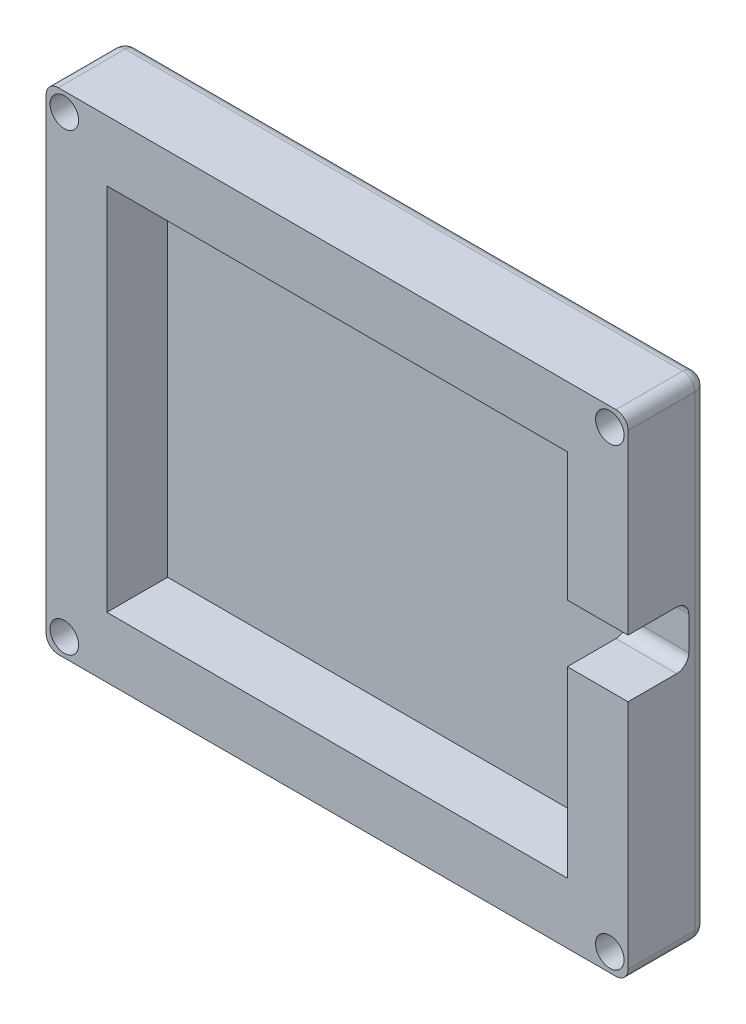
ISO-10303-21;
HEADER;
FILE_DESCRIPTION(('STEP AP214'),'2;1');
FILE_NAME('part.step','',(''),(''),'','','');
FILE_SCHEMA(('AUTOMOTIVE_DESIGN { 1 0 10303 214 1 1 1 1 }'));
ENDSEC;
DATA;
#1=APPLICATION_CONTEXT('core data for automotive mechanical design processes');
#2=APPLICATION_PROTOCOL_DEFINITION('international standard','automotive_design',2000,#1);
#3=PRODUCT_CONTEXT('',#1,'mechanical');
#4=PRODUCT('Part','Part','',(#3));
#5=PRODUCT_RELATED_PRODUCT_CATEGORY('part','',(#4));
#6=PRODUCT_DEFINITION_FORMATION('','',#4);
#7=PRODUCT_DEFINITION_CONTEXT('part definition',#1,'design');
#8=PRODUCT_DEFINITION('design','',#6,#7);
#9=PRODUCT_DEFINITION_SHAPE('','',#8);
#10=(LENGTH_UNIT() NAMED_UNIT(*) SI_UNIT(.MILLI.,.METRE.));
#11=(NAMED_UNIT(*) PLANE_ANGLE_UNIT() SI_UNIT($,.RADIAN.));
#12=(NAMED_UNIT(*) SI_UNIT($,.STERADIAN.) SOLID_ANGLE_UNIT());
#13=UNCERTAINTY_MEASURE_WITH_UNIT(LENGTH_MEASURE(1.E-05),#10,'distance_accuracy_value','');
#14=(GEOMETRIC_REPRESENTATION_CONTEXT(3) GLOBAL_UNCERTAINTY_ASSIGNED_CONTEXT((#13)) GLOBAL_UNIT_ASSIGNED_CONTEXT((#10,
#11,#12)) REPRESENTATION_CONTEXT('',''));
#15=CARTESIAN_POINT('',(0.,0.,0.));
#16=DIRECTION('',(0.,0.,1.));
#17=DIRECTION('',(1.,0.,0.));
#18=AXIS2_PLACEMENT_3D('',#15,#16,#17);
#19=CARTESIAN_POINT('',(-10.0000004749745,-9.99999977648258,0.));
#20=DIRECTION('',(0.,-1.,0.));
#21=DIRECTION('',(0.,0.,-1.));
#22=AXIS2_PLACEMENT_3D('',#19,#20,#21);
#23=PLANE('',#22);
#24=DIRECTION('',(0.,0.,-1.));
#25=VECTOR('',#24,1.);
#26=CARTESIAN_POINT('',(83.7999980822206,-9.99999977648258,0.));
#27=LINE('',#26,#25);
#28=CARTESIAN_POINT('',(83.7999980822206,-9.99999977648258,13.));
#29=VERTEX_POINT('',#28);
#30=CARTESIAN_POINT('',(83.7999980822206,-9.99999977648258,2.));
#31=VERTEX_POINT('',#30);
#32=EDGE_CURVE('E283',#29,#31,#27,.T.);
#33=ORIENTED_EDGE('',*,*,#32,.F.);
#34=DIRECTION('',(1.,0.,0.));
#35=VECTOR('',#34,1.);
#36=CARTESIAN_POINT('',(85.7999980822206,-9.99999977648258,13.));
#37=LINE('',#36,#35);
#38=CARTESIAN_POINT('',(-8.00000047497452,-9.99999977648258,13.));
#39=VERTEX_POINT('',#38);
#40=EDGE_CURVE('E322',#39,#29,#37,.T.);
#41=ORIENTED_EDGE('',*,*,#40,.F.);
#42=DIRECTION('',(0.,0.,1.));
#43=VECTOR('',#42,1.);
#44=CARTESIAN_POINT('',(-8.00000047497451,-9.99999977648258,0.));
#45=LINE('',#44,#43);
#46=CARTESIAN_POINT('',(-8.00000047497451,-9.99999977648258,2.));
#47=VERTEX_POINT('',#46);
#48=EDGE_CURVE('E266',#47,#39,#45,.T.);
#49=ORIENTED_EDGE('',*,*,#48,.F.);
#50=DIRECTION('',(-1.,0.,0.));
#51=VECTOR('',#50,1.);
#52=CARTESIAN_POINT('',(13.9499997625127,-9.99999977648258,2.));
#53=LINE('',#52,#51);
#54=EDGE_CURVE('E409',#31,#47,#53,.T.);
#55=ORIENTED_EDGE('',*,*,#54,.F.);
#56=EDGE_LOOP('',(#33,#41,#49,#55));
#57=FACE_BOUND('',#56,.T.);
#58=ADVANCED_FACE('F15',(#57),#23,.T.);
#59=CARTESIAN_POINT('',(-10.0000004749745,70.8000033628196,0.));
#60=DIRECTION('',(-1.,0.,0.));
#61=DIRECTION('',(0.,0.,1.));
#62=AXIS2_PLACEMENT_3D('',#59,#60,#61);
#63=PLANE('',#62);
#64=DIRECTION('',(0.,0.,-1.));
#65=VECTOR('',#64,1.);
#66=CARTESIAN_POINT('',(-10.0000004749745,-7.99999977648258,0.));
#67=LINE('',#66,#65);
#68=CARTESIAN_POINT('',(-10.0000004749745,-7.99999977648258,13.));
#69=VERTEX_POINT('',#68);
#70=CARTESIAN_POINT('',(-10.0000004749745,-7.99999977648259,2.));
#71=VERTEX_POINT('',#70);
#72=EDGE_CURVE('E270',#69,#71,#67,.T.);
#73=ORIENTED_EDGE('',*,*,#72,.F.);
#74=DIRECTION('',(0.,-1.,0.));
#75=VECTOR('',#74,1.);
#76=CARTESIAN_POINT('',(-10.0000004749745,-9.99999977648258,13.));
#77=LINE('',#76,#75);
#78=CARTESIAN_POINT('',(-10.0000004749745,68.8000033628196,13.));
#79=VERTEX_POINT('',#78);
#80=EDGE_CURVE('E325',#79,#69,#77,.T.);
#81=ORIENTED_EDGE('',*,*,#80,.F.);
#82=DIRECTION('',(0.,0.,1.));
#83=VECTOR('',#82,1.);
#84=CARTESIAN_POINT('',(-10.0000004749745,68.8000033628196,0.));
#85=LINE('',#84,#83);
#86=CARTESIAN_POINT('',(-10.0000004749745,68.8000033628196,2.));
#87=VERTEX_POINT('',#86);
#88=EDGE_CURVE('E272',#87,#79,#85,.T.);
#89=ORIENTED_EDGE('',*,*,#88,.F.);
#90=DIRECTION('',(0.,1.,0.));
#91=VECTOR('',#90,1.);
#92=CARTESIAN_POINT('',(-10.0000004749745,50.6000016814098,2.));
#93=LINE('',#92,#91);
#94=EDGE_CURVE('E437',#71,#87,#93,.T.);
#95=ORIENTED_EDGE('',*,*,#94,.F.);
#96=EDGE_LOOP('',(#73,#81,#89,#95));
#97=FACE_BOUND('',#96,.T.);
#98=ADVANCED_FACE('F801',(#97),#63,.T.);
#99=CARTESIAN_POINT('',(0.,0.,0.));
#100=DIRECTION('',(1.,0.,0.));
#101=DIRECTION('',(0.,1.,0.));
#102=AXIS2_PLACEMENT_3D('',#99,#100,#101);
#103=PLANE('',#102);
#104=DIRECTION('',(0.,-1.,0.));
#105=VECTOR('',#104,1.);
#106=CARTESIAN_POINT('',(0.,60.8,3.));
#107=LINE('',#106,#105);
#108=CARTESIAN_POINT('',(0.,60.8,3.));
#109=VERTEX_POINT('',#108);
#110=CARTESIAN_POINT('',(0.,0.,3.));
#111=VERTEX_POINT('',#110);
#112=EDGE_CURVE('E505',#109,#111,#107,.T.);
#113=ORIENTED_EDGE('',*,*,#112,.F.);
#114=DIRECTION('',(0.,0.,1.));
#115=VECTOR('',#114,1.);
#116=CARTESIAN_POINT('',(0.,60.7999986410141,0.));
#117=LINE('',#116,#115);
#118=CARTESIAN_POINT('',(0.,60.7999986410141,13.));
#119=VERTEX_POINT('',#118);
#120=EDGE_CURVE('E9',#109,#119,#117,.T.);
#121=ORIENTED_EDGE('',*,*,#120,.T.);
#122=DIRECTION('',(0.,1.,0.));
#123=VECTOR('',#122,1.);
#124=CARTESIAN_POINT('',(0.,0.,13.));
#125=LINE('',#124,#123);
#126=CARTESIAN_POINT('',(0.,0.,13.));
#127=VERTEX_POINT('',#126);
#128=EDGE_CURVE('E469',#127,#119,#125,.T.);
#129=ORIENTED_EDGE('',*,*,#128,.F.);
#130=DIRECTION('',(0.,0.,1.));
#131=VECTOR('',#130,1.);
#132=CARTESIAN_POINT('',(0.,0.,0.));
#133=LINE('',#132,#131);
#134=EDGE_CURVE('E23',#111,#127,#133,.T.);
#135=ORIENTED_EDGE('',*,*,#134,.F.);
#136=EDGE_LOOP('',(#113,#121,#129,#135));
#137=FACE_BOUND('',#136,.T.);
#138=ADVANCED_FACE('F809',(#137),#103,.T.);
#139=CARTESIAN_POINT('',(0.,60.7999986410141,0.));
#140=DIRECTION('',(0.,-1.,0.));
#141=DIRECTION('',(0.,0.,-1.));
#142=AXIS2_PLACEMENT_3D('',#139,#140,#141);
#143=PLANE('',#142);
#144=DIRECTION('',(-1.,0.,0.));
#145=VECTOR('',#144,1.);
#146=CARTESIAN_POINT('',(75.8,60.8,3.));
#147=LINE('',#146,#145);
#148=CARTESIAN_POINT('',(75.8,60.8,3.));
#149=VERTEX_POINT('',#148);
#150=EDGE_CURVE('E501',#149,#109,#147,.T.);
#151=ORIENTED_EDGE('',*,*,#150,.F.);
#152=DIRECTION('',(0.,0.,1.));
#153=VECTOR('',#152,1.);
#154=CARTESIAN_POINT('',(75.799998305738,60.7999986410141,0.));
#155=LINE('',#154,#153);
#156=CARTESIAN_POINT('',(75.799998305738,60.7999986410141,13.));
#157=VERTEX_POINT('',#156);
#158=EDGE_CURVE('E445',#149,#157,#155,.T.);
#159=ORIENTED_EDGE('',*,*,#158,.T.);
#160=DIRECTION('',(1.,0.,0.));
#161=VECTOR('',#160,1.);
#162=CARTESIAN_POINT('',(0.,60.7999986410141,13.));
#163=LINE('',#162,#161);
#164=EDGE_CURVE('E473',#119,#157,#163,.T.);
#165=ORIENTED_EDGE('',*,*,#164,.F.);
#166=ORIENTED_EDGE('',*,*,#120,.F.);
#167=EDGE_LOOP('',(#151,#159,#165,#166));
#168=FACE_BOUND('',#167,.T.);
#169=ADVANCED_FACE('F817',(#168),#143,.T.);
#170=CARTESIAN_POINT('',(75.799998305738,0.,0.));
#171=DIRECTION('',(0.,1.,0.));
#172=DIRECTION('',(1.,0.,0.));
#173=AXIS2_PLACEMENT_3D('',#170,#171,#172);
#174=PLANE('',#173);
#175=DIRECTION('',(1.,0.,0.));
#176=VECTOR('',#175,1.);
#177=CARTESIAN_POINT('',(0.,0.,3.));
#178=LINE('',#177,#176);
#179=CARTESIAN_POINT('',(75.8,0.,3.));
#180=VERTEX_POINT('',#179);
#181=EDGE_CURVE('E509',#111,#180,#178,.T.);
#182=ORIENTED_EDGE('',*,*,#181,.F.);
#183=ORIENTED_EDGE('',*,*,#134,.T.);
#184=DIRECTION('',(-1.,0.,0.));
#185=VECTOR('',#184,1.);
#186=CARTESIAN_POINT('',(75.799998305738,0.,13.));
#187=LINE('',#186,#185);
#188=CARTESIAN_POINT('',(75.799998305738,0.,13.));
#189=VERTEX_POINT('',#188);
#190=EDGE_CURVE('E474',#189,#127,#187,.T.);
#191=ORIENTED_EDGE('',*,*,#190,.F.);
#192=DIRECTION('',(0.,0.,1.));
#193=VECTOR('',#192,1.);
#194=CARTESIAN_POINT('',(75.799998305738,0.,0.));
#195=LINE('',#194,#193);
#196=EDGE_CURVE('E535',#180,#189,#195,.T.);
#197=ORIENTED_EDGE('',*,*,#196,.F.);
#198=EDGE_LOOP('',(#182,#183,#191,#197));
#199=FACE_BOUND('',#198,.T.);
#200=ADVANCED_FACE('F825',(#199),#174,.T.);
#201=CARTESIAN_POINT('',(37.899998803623,30.4000017931685,13.));
#202=DIRECTION('',(0.,0.,1.));
#203=DIRECTION('',(1.,0.,0.));
#204=AXIS2_PLACEMENT_3D('',#201,#202,#203);
#205=PLANE('',#204);
#206=CARTESIAN_POINT('',(82.7999980822206,-6.99999977648258,13.));
#207=DIRECTION('',(0.,0.,-1.));
#208=DIRECTION('',(1.,0.,0.));
#209=AXIS2_PLACEMENT_3D('',#206,#207,#208);
#210=CIRCLE('',#209,2.35);
#211=CARTESIAN_POINT('',(80.4499980822206,-6.99999977648258,13.));
#212=VERTEX_POINT('',#211);
#213=EDGE_CURVE('E331',#212,#212,#210,.T.);
#214=ORIENTED_EDGE('',*,*,#213,.T.);
#215=EDGE_LOOP('',(#214));
#216=FACE_BOUND('',#215,.T.);
#217=CARTESIAN_POINT('',(-7.00000047497451,67.8000033628196,13.));
#218=DIRECTION('',(0.,0.,-1.));
#219=DIRECTION('',(1.,0.,0.));
#220=AXIS2_PLACEMENT_3D('',#217,#218,#219);
#221=CIRCLE('',#220,2.35);
#222=CARTESIAN_POINT('',(-9.35000047497451,67.8000033628196,13.));
#223=VERTEX_POINT('',#222);
#224=EDGE_CURVE('E307',#223,#223,#221,.T.);
#225=ORIENTED_EDGE('',*,*,#224,.T.);
#226=EDGE_LOOP('',(#225));
#227=FACE_BOUND('',#226,.T.);
#228=CARTESIAN_POINT('',(-7.00000047497451,-6.99999977648258,13.));
#229=DIRECTION('',(0.,0.,-1.));
#230=DIRECTION('',(1.,0.,0.));
#231=AXIS2_PLACEMENT_3D('',#228,#229,#230);
#232=CIRCLE('',#231,2.35);
#233=CARTESIAN_POINT('',(-9.35000047497451,-6.99999977648258,13.));
#234=VERTEX_POINT('',#233);
#235=EDGE_CURVE('E302',#234,#234,#232,.T.);
#236=ORIENTED_EDGE('',*,*,#235,.T.);
#237=EDGE_LOOP('',(#236));
#238=FACE_BOUND('',#237,.T.);
#239=CARTESIAN_POINT('',(82.7999980822206,67.8000033628196,13.));
#240=DIRECTION('',(0.,0.,-1.));
#241=DIRECTION('',(1.,0.,0.));
#242=AXIS2_PLACEMENT_3D('',#239,#240,#241);
#243=CIRCLE('',#242,2.35);
#244=CARTESIAN_POINT('',(80.4499980822206,67.8000033628196,13.));
#245=VERTEX_POINT('',#244);
#246=EDGE_CURVE('E249',#245,#245,#243,.T.);
#247=ORIENTED_EDGE('',*,*,#246,.T.);
#248=EDGE_LOOP('',(#247));
#249=FACE_BOUND('',#248,.T.);
#250=CARTESIAN_POINT('',(83.7999980822206,-7.99999977648258,13.));
#251=DIRECTION('',(0.,0.,-1.));
#252=DIRECTION('',(0.707106781186546,-0.707106781186549,0.));
#253=AXIS2_PLACEMENT_3D('',#250,#251,#252);
#254=CIRCLE('',#253,2.);
#255=CARTESIAN_POINT('',(85.7999980822206,-7.99999977648258,13.));
#256=VERTEX_POINT('',#255);
#257=EDGE_CURVE('E363',#256,#29,#254,.T.);
#258=ORIENTED_EDGE('',*,*,#257,.F.);
#259=DIRECTION('',(0.,1.,0.));
#260=VECTOR('',#259,1.);
#261=CARTESIAN_POINT('',(85.7999980822206,70.8000033628196,13.));
#262=LINE('',#261,#260);
#263=CARTESIAN_POINT('',(85.7999980822206,30.1500033628195,13.));
#264=VERTEX_POINT('',#263);
#265=EDGE_CURVE('E456',#256,#264,#262,.T.);
#266=ORIENTED_EDGE('',*,*,#265,.T.);
#267=DIRECTION('',(-1.,0.,0.));
#268=VECTOR('',#267,1.);
#269=CARTESIAN_POINT('',(61.8499984429218,30.1500033628195,13.));
#270=LINE('',#269,#268);
#271=CARTESIAN_POINT('',(75.7999980822206,30.1500033628195,13.));
#272=VERTEX_POINT('',#271);
#273=EDGE_CURVE('E524',#264,#272,#270,.T.);
#274=ORIENTED_EDGE('',*,*,#273,.T.);
#275=DIRECTION('',(0.,-1.,0.));
#276=VECTOR('',#275,1.);
#277=CARTESIAN_POINT('',(75.799998305738,60.7999986410141,13.));
#278=LINE('',#277,#276);
#279=EDGE_CURVE('E446',#272,#189,#278,.T.);
#280=ORIENTED_EDGE('',*,*,#279,.T.);
#281=ORIENTED_EDGE('',*,*,#190,.T.);
#282=ORIENTED_EDGE('',*,*,#128,.T.);
#283=ORIENTED_EDGE('',*,*,#164,.T.);
#284=DIRECTION('',(0.,-1.,0.));
#285=VECTOR('',#284,1.);
#286=CARTESIAN_POINT('',(75.799998305738,60.7999986410141,13.));
#287=LINE('',#286,#285);
#288=CARTESIAN_POINT('',(75.7999980822206,39.6500033628195,13.));
#289=VERTEX_POINT('',#288);
#290=EDGE_CURVE('E442',#157,#289,#287,.T.);
#291=ORIENTED_EDGE('',*,*,#290,.T.);
#292=DIRECTION('',(1.,0.,0.));
#293=VECTOR('',#292,1.);
#294=CARTESIAN_POINT('',(61.8499984429218,39.6500033628195,13.));
#295=LINE('',#294,#293);
#296=CARTESIAN_POINT('',(85.7999980822206,39.6500033628195,13.));
#297=VERTEX_POINT('',#296);
#298=EDGE_CURVE('E528',#289,#297,#295,.T.);
#299=ORIENTED_EDGE('',*,*,#298,.T.);
#300=DIRECTION('',(0.,1.,0.));
#301=VECTOR('',#300,1.);
#302=CARTESIAN_POINT('',(85.7999980822206,70.8000033628196,13.));
#303=LINE('',#302,#301);
#304=CARTESIAN_POINT('',(85.7999980822206,68.8000033628196,13.));
#305=VERTEX_POINT('',#304);
#306=EDGE_CURVE('E276',#297,#305,#303,.T.);
#307=ORIENTED_EDGE('',*,*,#306,.T.);
#308=CARTESIAN_POINT('',(83.7999980822206,68.8000033628196,13.));
#309=DIRECTION('',(0.,0.,-1.));
#310=DIRECTION('',(0.707106781186544,0.707106781186551,0.));
#311=AXIS2_PLACEMENT_3D('',#308,#309,#310);
#312=CIRCLE('',#311,2.);
#313=CARTESIAN_POINT('',(83.7999980822206,70.8000033628196,13.));
#314=VERTEX_POINT('',#313);
#315=EDGE_CURVE('E350',#314,#305,#312,.T.);
#316=ORIENTED_EDGE('',*,*,#315,.F.);
#317=DIRECTION('',(-1.,0.,0.));
#318=VECTOR('',#317,1.);
#319=CARTESIAN_POINT('',(-10.0000004749745,70.8000033628196,13.));
#320=LINE('',#319,#318);
#321=CARTESIAN_POINT('',(-8.00000047497452,70.8000033628196,13.));
#322=VERTEX_POINT('',#321);
#323=EDGE_CURVE('E484',#314,#322,#320,.T.);
#324=ORIENTED_EDGE('',*,*,#323,.T.);
#325=CARTESIAN_POINT('',(-8.00000047497452,68.8000033628196,13.));
#326=DIRECTION('',(0.,0.,-1.));
#327=DIRECTION('',(-0.707106781186548,0.707106781186547,0.));
#328=AXIS2_PLACEMENT_3D('',#325,#326,#327);
#329=CIRCLE('',#328,2.);
#330=EDGE_CURVE('E441',#79,#322,#329,.T.);
#331=ORIENTED_EDGE('',*,*,#330,.F.);
#332=ORIENTED_EDGE('',*,*,#80,.T.);
#333=CARTESIAN_POINT('',(-8.00000047497451,-7.99999977648258,13.));
#334=DIRECTION('',(0.,0.,-1.));
#335=DIRECTION('',(-0.707106781186548,-0.707106781186547,0.));
#336=AXIS2_PLACEMENT_3D('',#333,#334,#335);
#337=CIRCLE('',#336,2.);
#338=EDGE_CURVE('E394',#39,#69,#337,.T.);
#339=ORIENTED_EDGE('',*,*,#338,.F.);
#340=ORIENTED_EDGE('',*,*,#40,.T.);
#341=EDGE_LOOP('',(#258,#266,#274,#280,#281,#282,#283,#291,#299,#307,#316,#324,#331,#332,#339,#340));
#342=FACE_BOUND('',#341,.T.);
#343=ADVANCED_FACE('F834',(#216,#227,#238,#249,#342),#205,.T.);
#344=CARTESIAN_POINT('',(75.799998305738,60.7999986410141,0.));
#345=DIRECTION('',(-1.,0.,0.));
#346=DIRECTION('',(0.,0.,1.));
#347=AXIS2_PLACEMENT_3D('',#344,#345,#346);
#348=PLANE('',#347);
#349=DIRECTION('',(0.,0.,1.));
#350=VECTOR('',#349,1.);
#351=CARTESIAN_POINT('',(75.799998305738,39.6500033628195,6.5));
#352=LINE('',#351,#350);
#353=CARTESIAN_POINT('',(75.799998305738,39.6500033628195,5.));
#354=VERTEX_POINT('',#353);
#355=EDGE_CURVE('E531',#354,#289,#352,.T.);
#356=ORIENTED_EDGE('',*,*,#355,.T.);
#357=ORIENTED_EDGE('',*,*,#290,.F.);
#358=ORIENTED_EDGE('',*,*,#158,.F.);
#359=DIRECTION('',(0.,1.,0.));
#360=VECTOR('',#359,1.);
#361=CARTESIAN_POINT('',(75.8,0.,3.));
#362=LINE('',#361,#360);
#363=CARTESIAN_POINT('',(75.799998305738,37.6500033628195,3.));
#364=VERTEX_POINT('',#363);
#365=EDGE_CURVE('E294',#364,#149,#362,.T.);
#366=ORIENTED_EDGE('',*,*,#365,.F.);
#367=CARTESIAN_POINT('',(75.799998305738,37.6500033628195,5.));
#368=DIRECTION('',(-1.,0.,0.));
#369=DIRECTION('',(0.,0.707106781186548,-0.707106781186547));
#370=AXIS2_PLACEMENT_3D('',#367,#368,#369);
#371=CIRCLE('',#370,2.);
#372=EDGE_CURVE('E487',#354,#364,#371,.T.);
#373=ORIENTED_EDGE('',*,*,#372,.F.);
#374=EDGE_LOOP('',(#356,#357,#358,#366,#373));
#375=FACE_BOUND('',#374,.T.);
#376=ADVANCED_FACE('F842',(#375),#348,.T.);
#377=CARTESIAN_POINT('',(75.799998305738,60.7999986410141,0.));
#378=DIRECTION('',(-1.,0.,0.));
#379=DIRECTION('',(0.,0.,1.));
#380=AXIS2_PLACEMENT_3D('',#377,#378,#379);
#381=PLANE('',#380);
#382=DIRECTION('',(0.,0.,-1.));
#383=VECTOR('',#382,1.);
#384=CARTESIAN_POINT('',(75.799998305738,30.1500033628195,1.50000002235175));
#385=LINE('',#384,#383);
#386=CARTESIAN_POINT('',(75.799998305738,30.1500033628195,5.));
#387=VERTEX_POINT('',#386);
#388=EDGE_CURVE('E425',#272,#387,#385,.T.);
#389=ORIENTED_EDGE('',*,*,#388,.T.);
#390=CARTESIAN_POINT('',(75.799998305738,32.1500033628195,5.));
#391=DIRECTION('',(-1.,0.,0.));
#392=DIRECTION('',(0.,-0.707106781186548,-0.707106781186547));
#393=AXIS2_PLACEMENT_3D('',#390,#391,#392);
#394=CIRCLE('',#393,2.);
#395=CARTESIAN_POINT('',(75.799998305738,32.1500033628195,3.));
#396=VERTEX_POINT('',#395);
#397=EDGE_CURVE('E426',#396,#387,#394,.T.);
#398=ORIENTED_EDGE('',*,*,#397,.F.);
#399=DIRECTION('',(0.,1.,0.));
#400=VECTOR('',#399,1.);
#401=CARTESIAN_POINT('',(75.8,0.,3.));
#402=LINE('',#401,#400);
#403=EDGE_CURVE('E495',#180,#396,#402,.T.);
#404=ORIENTED_EDGE('',*,*,#403,.F.);
#405=ORIENTED_EDGE('',*,*,#196,.T.);
#406=ORIENTED_EDGE('',*,*,#279,.F.);
#407=EDGE_LOOP('',(#389,#398,#404,#405,#406));
#408=FACE_BOUND('',#407,.T.);
#409=ADVANCED_FACE('F851',(#408),#381,.T.);
#410=CARTESIAN_POINT('',(85.7999980822206,39.6500033628195,13.));
#411=DIRECTION('',(0.,1.,0.));
#412=DIRECTION('',(1.,0.,0.));
#413=AXIS2_PLACEMENT_3D('',#410,#411,#412);
#414=PLANE('',#413);
#415=DIRECTION('',(-1.,0.,0.));
#416=VECTOR('',#415,1.);
#417=CARTESIAN_POINT('',(61.8499990411103,39.6500033628195,5.));
#418=LINE('',#417,#416);
#419=CARTESIAN_POINT('',(85.7999980822206,39.6500033628195,5.));
#420=VERTEX_POINT('',#419);
#421=EDGE_CURVE('E290',#420,#354,#418,.T.);
#422=ORIENTED_EDGE('',*,*,#421,.F.);
#423=DIRECTION('',(0.,0.,-1.));
#424=VECTOR('',#423,1.);
#425=CARTESIAN_POINT('',(85.7999980822206,39.6500033628195,6.5));
#426=LINE('',#425,#424);
#427=EDGE_CURVE('E460',#297,#420,#426,.T.);
#428=ORIENTED_EDGE('',*,*,#427,.F.);
#429=ORIENTED_EDGE('',*,*,#298,.F.);
#430=ORIENTED_EDGE('',*,*,#355,.F.);
#431=EDGE_LOOP('',(#422,#428,#429,#430));
#432=FACE_BOUND('',#431,.T.);
#433=ADVANCED_FACE('F862',(#432),#414,.F.);
#434=CARTESIAN_POINT('',(85.7999980822206,30.1500033628195,3.00000004470351));
#435=DIRECTION('',(0.,-1.,0.));
#436=DIRECTION('',(0.,0.,-1.));
#437=AXIS2_PLACEMENT_3D('',#434,#435,#436);
#438=PLANE('',#437);
#439=DIRECTION('',(1.,0.,0.));
#440=VECTOR('',#439,1.);
#441=CARTESIAN_POINT('',(61.8499990411103,30.1500033628195,5.));
#442=LINE('',#441,#440);
#443=CARTESIAN_POINT('',(85.7999980822206,30.1500033628195,5.));
#444=VERTEX_POINT('',#443);
#445=EDGE_CURVE('E422',#387,#444,#442,.T.);
#446=ORIENTED_EDGE('',*,*,#445,.F.);
#447=ORIENTED_EDGE('',*,*,#388,.F.);
#448=ORIENTED_EDGE('',*,*,#273,.F.);
#449=DIRECTION('',(0.,0.,1.));
#450=VECTOR('',#449,1.);
#451=CARTESIAN_POINT('',(85.7999980822206,30.1500033628195,1.50000002235175));
#452=LINE('',#451,#450);
#453=EDGE_CURVE('E452',#444,#264,#452,.T.);
#454=ORIENTED_EDGE('',*,*,#453,.F.);
#455=EDGE_LOOP('',(#446,#447,#448,#454));
#456=FACE_BOUND('',#455,.T.);
#457=ADVANCED_FACE('F857',(#456),#438,.F.);
#458=CARTESIAN_POINT('',(61.8499990411103,32.1500033628195,5.));
#459=DIRECTION('',(-1.,0.,0.));
#460=DIRECTION('',(0.,-0.707106781186548,-0.707106781186547));
#461=AXIS2_PLACEMENT_3D('',#458,#459,#460);
#462=CYLINDRICAL_SURFACE('',#461,2.);
#463=ORIENTED_EDGE('',*,*,#397,.T.);
#464=ORIENTED_EDGE('',*,*,#445,.T.);
#465=CARTESIAN_POINT('',(85.7999980822206,32.1500033628195,5.));
#466=DIRECTION('',(1.,0.,0.));
#467=DIRECTION('',(0.,-0.707106781186548,-0.707106781186547));
#468=AXIS2_PLACEMENT_3D('',#465,#466,#467);
#469=CIRCLE('',#468,2.);
#470=CARTESIAN_POINT('',(85.7999980822206,32.1500033628195,3.00000004470351));
#471=VERTEX_POINT('',#470);
#472=EDGE_CURVE('E457',#444,#471,#469,.T.);
#473=ORIENTED_EDGE('',*,*,#472,.T.);
#474=DIRECTION('',(-1.,0.,0.));
#475=VECTOR('',#474,1.);
#476=CARTESIAN_POINT('',(61.8499990411103,32.1500033628195,3.));
#477=LINE('',#476,#475);
#478=EDGE_CURVE('E491',#471,#396,#477,.T.);
#479=ORIENTED_EDGE('',*,*,#478,.T.);
#480=EDGE_LOOP('',(#463,#464,#473,#479));
#481=FACE_BOUND('',#480,.T.);
#482=ADVANCED_FACE('F861',(#481),#462,.F.);
#483=CARTESIAN_POINT('',(37.9,30.4,3.));
#484=DIRECTION('',(0.,0.,1.));
#485=DIRECTION('',(1.,0.,0.));
#486=AXIS2_PLACEMENT_3D('',#483,#484,#485);
#487=PLANE('',#486);
#488=DIRECTION('',(1.,0.,0.));
#489=VECTOR('',#488,1.);
#490=CARTESIAN_POINT('',(61.8499990411103,37.6500033628195,3.));
#491=LINE('',#490,#489);
#492=CARTESIAN_POINT('',(85.7999980822206,37.6500033628195,3.00000004470351));
#493=VERTEX_POINT('',#492);
#494=EDGE_CURVE('E295',#364,#493,#491,.T.);
#495=ORIENTED_EDGE('',*,*,#494,.F.);
#496=ORIENTED_EDGE('',*,*,#365,.T.);
#497=ORIENTED_EDGE('',*,*,#150,.T.);
#498=ORIENTED_EDGE('',*,*,#112,.T.);
#499=ORIENTED_EDGE('',*,*,#181,.T.);
#500=ORIENTED_EDGE('',*,*,#403,.T.);
#501=ORIENTED_EDGE('',*,*,#478,.F.);
#502=DIRECTION('',(0.,-1.,0.));
#503=VECTOR('',#502,1.);
#504=CARTESIAN_POINT('',(85.7999980822206,14.8250017931685,3.00000004470351));
#505=LINE('',#504,#503);
#506=EDGE_CURVE('E468',#493,#471,#505,.T.);
#507=ORIENTED_EDGE('',*,*,#506,.F.);
#508=EDGE_LOOP('',(#495,#496,#497,#498,#499,#500,#501,#507));
#509=FACE_BOUND('',#508,.T.);
#510=ADVANCED_FACE('F871',(#509),#487,.T.);
#511=CARTESIAN_POINT('',(61.8499990411103,37.6500033628195,5.));
#512=DIRECTION('',(-1.,0.,0.));
#513=DIRECTION('',(0.,0.707106781186548,-0.707106781186547));
#514=AXIS2_PLACEMENT_3D('',#511,#512,#513);
#515=CYLINDRICAL_SURFACE('',#514,2.);
#516=ORIENTED_EDGE('',*,*,#372,.T.);
#517=ORIENTED_EDGE('',*,*,#494,.T.);
#518=CARTESIAN_POINT('',(85.7999980822206,37.6500033628195,5.));
#519=DIRECTION('',(1.,0.,0.));
#520=DIRECTION('',(0.,0.707106781186548,-0.707106781186547));
#521=AXIS2_PLACEMENT_3D('',#518,#519,#520);
#522=CIRCLE('',#521,2.);
#523=EDGE_CURVE('E464',#493,#420,#522,.T.);
#524=ORIENTED_EDGE('',*,*,#523,.T.);
#525=ORIENTED_EDGE('',*,*,#421,.T.);
#526=EDGE_LOOP('',(#516,#517,#524,#525));
#527=FACE_BOUND('',#526,.T.);
#528=ADVANCED_FACE('F880',(#527),#515,.F.);
#529=CARTESIAN_POINT('',(37.9,30.4,0.));
#530=DIRECTION('',(0.,0.,1.));
#531=DIRECTION('',(1.,0.,0.));
#532=AXIS2_PLACEMENT_3D('',#529,#530,#531);
#533=PLANE('',#532);
#534=DIRECTION('',(1.,0.,0.));
#535=VECTOR('',#534,1.);
#536=CARTESIAN_POINT('',(13.9499997625127,-7.99999977648258,0.));
#537=LINE('',#536,#535);
#538=CARTESIAN_POINT('',(-8.00000047497451,-7.99999977648258,0.));
#539=VERTEX_POINT('',#538);
#540=CARTESIAN_POINT('',(83.7999980822206,-7.99999977648258,0.));
#541=VERTEX_POINT('',#540);
#542=EDGE_CURVE('E405',#539,#541,#537,.T.);
#543=ORIENTED_EDGE('',*,*,#542,.F.);
#544=DIRECTION('',(0.,-1.,0.));
#545=VECTOR('',#544,1.);
#546=CARTESIAN_POINT('',(-8.00000047497451,50.6000016814098,0.));
#547=LINE('',#546,#545);
#548=CARTESIAN_POINT('',(-8.00000047497451,68.8000033628196,0.));
#549=VERTEX_POINT('',#548);
#550=EDGE_CURVE('E269',#549,#539,#547,.T.);
#551=ORIENTED_EDGE('',*,*,#550,.F.);
#552=DIRECTION('',(-1.,0.,0.));
#553=VECTOR('',#552,1.);
#554=CARTESIAN_POINT('',(61.8499990411103,68.8000033628196,0.));
#555=LINE('',#554,#553);
#556=CARTESIAN_POINT('',(83.7999980822206,68.8000033628196,0.));
#557=VERTEX_POINT('',#556);
#558=EDGE_CURVE('E282',#557,#549,#555,.T.);
#559=ORIENTED_EDGE('',*,*,#558,.F.);
#560=DIRECTION('',(0.,1.,0.));
#561=VECTOR('',#560,1.);
#562=CARTESIAN_POINT('',(83.7999980822206,10.2000001117587,0.));
#563=LINE('',#562,#561);
#564=EDGE_CURVE('E413',#541,#557,#563,.T.);
#565=ORIENTED_EDGE('',*,*,#564,.F.);
#566=EDGE_LOOP('',(#543,#551,#559,#565));
#567=FACE_BOUND('',#566,.T.);
#568=ADVANCED_FACE('F889',(#567),#533,.F.);
#569=CARTESIAN_POINT('',(85.7999980822206,70.8000033628196,0.));
#570=DIRECTION('',(0.,1.,0.));
#571=DIRECTION('',(1.,0.,0.));
#572=AXIS2_PLACEMENT_3D('',#569,#570,#571);
#573=PLANE('',#572);
#574=DIRECTION('',(0.,0.,1.));
#575=VECTOR('',#574,1.);
#576=CARTESIAN_POINT('',(83.7999980822206,70.8000033628196,0.));
#577=LINE('',#576,#575);
#578=CARTESIAN_POINT('',(83.7999980822206,70.8000033628196,2.));
#579=VERTEX_POINT('',#578);
#580=EDGE_CURVE('E390',#579,#314,#577,.T.);
#581=ORIENTED_EDGE('',*,*,#580,.F.);
#582=DIRECTION('',(1.,0.,0.));
#583=VECTOR('',#582,1.);
#584=CARTESIAN_POINT('',(61.8499990411103,70.8000033628196,2.));
#585=LINE('',#584,#583);
#586=CARTESIAN_POINT('',(-8.00000047497452,70.8000033628196,2.));
#587=VERTEX_POINT('',#586);
#588=EDGE_CURVE('E355',#587,#579,#585,.T.);
#589=ORIENTED_EDGE('',*,*,#588,.F.);
#590=DIRECTION('',(0.,0.,-1.));
#591=VECTOR('',#590,1.);
#592=CARTESIAN_POINT('',(-8.00000047497452,70.8000033628196,0.));
#593=LINE('',#592,#591);
#594=EDGE_CURVE('E277',#322,#587,#593,.T.);
#595=ORIENTED_EDGE('',*,*,#594,.F.);
#596=ORIENTED_EDGE('',*,*,#323,.F.);
#597=EDGE_LOOP('',(#581,#589,#595,#596));
#598=FACE_BOUND('',#597,.T.);
#599=ADVANCED_FACE('F898',(#598),#573,.T.);
#600=CARTESIAN_POINT('',(85.7999980822206,-9.99999977648258,0.));
#601=DIRECTION('',(1.,0.,0.));
#602=DIRECTION('',(0.,1.,0.));
#603=AXIS2_PLACEMENT_3D('',#600,#601,#602);
#604=PLANE('',#603);
#605=DIRECTION('',(0.,0.,1.));
#606=VECTOR('',#605,1.);
#607=CARTESIAN_POINT('',(85.7999980822206,-7.99999977648258,0.));
#608=LINE('',#607,#606);
#609=CARTESIAN_POINT('',(85.7999980822206,-7.99999977648258,2.));
#610=VERTEX_POINT('',#609);
#611=EDGE_CURVE('E278',#610,#256,#608,.T.);
#612=ORIENTED_EDGE('',*,*,#611,.F.);
#613=DIRECTION('',(0.,-1.,0.));
#614=VECTOR('',#613,1.);
#615=CARTESIAN_POINT('',(85.7999980822206,10.2000001117587,2.));
#616=LINE('',#615,#614);
#617=CARTESIAN_POINT('',(85.7999980822206,68.8000033628195,2.));
#618=VERTEX_POINT('',#617);
#619=EDGE_CURVE('E367',#618,#610,#616,.T.);
#620=ORIENTED_EDGE('',*,*,#619,.F.);
#621=DIRECTION('',(0.,0.,-1.));
#622=VECTOR('',#621,1.);
#623=CARTESIAN_POINT('',(85.7999980822206,68.8000033628196,0.));
#624=LINE('',#623,#622);
#625=EDGE_CURVE('E354',#305,#618,#624,.T.);
#626=ORIENTED_EDGE('',*,*,#625,.F.);
#627=ORIENTED_EDGE('',*,*,#306,.F.);
#628=ORIENTED_EDGE('',*,*,#427,.T.);
#629=ORIENTED_EDGE('',*,*,#523,.F.);
#630=ORIENTED_EDGE('',*,*,#506,.T.);
#631=ORIENTED_EDGE('',*,*,#472,.F.);
#632=ORIENTED_EDGE('',*,*,#453,.T.);
#633=ORIENTED_EDGE('',*,*,#265,.F.);
#634=EDGE_LOOP('',(#612,#620,#626,#627,#628,#629,#630,#631,#632,#633));
#635=FACE_BOUND('',#634,.T.);
#636=ADVANCED_FACE('F907',(#635),#604,.T.);
#637=CARTESIAN_POINT('',(-8.00000047497452,68.8000033628196,0.));
#638=DIRECTION('',(0.,0.,1.));
#639=DIRECTION('',(-0.707106781186548,0.707106781186547,0.));
#640=AXIS2_PLACEMENT_3D('',#637,#638,#639);
#641=CYLINDRICAL_SURFACE('',#640,2.);
#642=ORIENTED_EDGE('',*,*,#330,.T.);
#643=ORIENTED_EDGE('',*,*,#594,.T.);
#644=CARTESIAN_POINT('',(-8.00000047497452,68.8000033628196,2.));
#645=DIRECTION('',(0.,0.,1.));
#646=DIRECTION('',(0.,1.,0.));
#647=AXIS2_PLACEMENT_3D('',#644,#645,#646);
#648=CIRCLE('',#647,2.);
#649=EDGE_CURVE('E338',#587,#87,#648,.T.);
#650=ORIENTED_EDGE('',*,*,#649,.T.);
#651=ORIENTED_EDGE('',*,*,#88,.T.);
#652=EDGE_LOOP('',(#642,#643,#650,#651));
#653=FACE_BOUND('',#652,.T.);
#654=ADVANCED_FACE('F916',(#653),#641,.T.);
#655=CARTESIAN_POINT('',(-8.00000047497451,50.6000016814098,2.));
#656=DIRECTION('',(0.,1.,0.));
#657=DIRECTION('',(-0.707106781186548,0.,-0.707106781186547));
#658=AXIS2_PLACEMENT_3D('',#655,#656,#657);
#659=CYLINDRICAL_SURFACE('',#658,2.);
#660=CARTESIAN_POINT('',(-8.00000047497451,68.8000033628196,2.));
#661=DIRECTION('',(0.,-1.,0.));
#662=DIRECTION('',(-1.,0.,0.));
#663=AXIS2_PLACEMENT_3D('',#660,#661,#662);
#664=CIRCLE('',#663,2.);
#665=EDGE_CURVE('E349',#87,#549,#664,.T.);
#666=ORIENTED_EDGE('',*,*,#665,.T.);
#667=ORIENTED_EDGE('',*,*,#550,.T.);
#668=CARTESIAN_POINT('',(-8.00000047497451,-7.99999977648258,2.));
#669=DIRECTION('',(0.,1.,0.));
#670=DIRECTION('',(0.,0.,-1.));
#671=AXIS2_PLACEMENT_3D('',#668,#669,#670);
#672=CIRCLE('',#671,2.);
#673=EDGE_CURVE('E359',#539,#71,#672,.T.);
#674=ORIENTED_EDGE('',*,*,#673,.T.);
#675=ORIENTED_EDGE('',*,*,#94,.T.);
#676=EDGE_LOOP('',(#666,#667,#674,#675));
#677=FACE_BOUND('',#676,.T.);
#678=ADVANCED_FACE('F925',(#677),#659,.T.);
#679=CARTESIAN_POINT('',(-8.00000047497451,-7.99999977648258,0.));
#680=DIRECTION('',(0.,0.,1.));
#681=DIRECTION('',(-0.707106781186548,-0.707106781186547,0.));
#682=AXIS2_PLACEMENT_3D('',#679,#680,#681);
#683=CYLINDRICAL_SURFACE('',#682,2.);
#684=ORIENTED_EDGE('',*,*,#338,.T.);
#685=ORIENTED_EDGE('',*,*,#72,.T.);
#686=CARTESIAN_POINT('',(-8.00000047497451,-7.99999977648258,2.));
#687=DIRECTION('',(0.,0.,1.));
#688=DIRECTION('',(-1.,0.,0.));
#689=AXIS2_PLACEMENT_3D('',#686,#687,#688);
#690=CIRCLE('',#689,2.);
#691=EDGE_CURVE('E375',#71,#47,#690,.T.);
#692=ORIENTED_EDGE('',*,*,#691,.T.);
#693=ORIENTED_EDGE('',*,*,#48,.T.);
#694=EDGE_LOOP('',(#684,#685,#692,#693));
#695=FACE_BOUND('',#694,.T.);
#696=ADVANCED_FACE('F931',(#695),#683,.T.);
#697=CARTESIAN_POINT('',(83.7999980822206,68.8000033628196,0.));
#698=DIRECTION('',(0.,0.,1.));
#699=DIRECTION('',(0.707106781186544,0.707106781186551,0.));
#700=AXIS2_PLACEMENT_3D('',#697,#698,#699);
#701=CYLINDRICAL_SURFACE('',#700,2.);
#702=ORIENTED_EDGE('',*,*,#315,.T.);
#703=ORIENTED_EDGE('',*,*,#625,.T.);
#704=CARTESIAN_POINT('',(83.7999980822206,68.8000033628196,2.));
#705=DIRECTION('',(0.,0.,1.));
#706=DIRECTION('',(1.,0.,0.));
#707=AXIS2_PLACEMENT_3D('',#704,#705,#706);
#708=CIRCLE('',#707,2.);
#709=EDGE_CURVE('E379',#618,#579,#708,.T.);
#710=ORIENTED_EDGE('',*,*,#709,.T.);
#711=ORIENTED_EDGE('',*,*,#580,.T.);
#712=EDGE_LOOP('',(#702,#703,#710,#711));
#713=FACE_BOUND('',#712,.T.);
#714=ADVANCED_FACE('F935',(#713),#701,.T.);
#715=CARTESIAN_POINT('',(61.8499990411103,68.8000033628196,2.));
#716=DIRECTION('',(1.,0.,0.));
#717=DIRECTION('',(0.,0.707106781186549,-0.707106781186546));
#718=AXIS2_PLACEMENT_3D('',#715,#716,#717);
#719=CYLINDRICAL_SURFACE('',#718,2.);
#720=CARTESIAN_POINT('',(83.7999980822206,68.8000033628196,2.));
#721=DIRECTION('',(-1.,0.,0.));
#722=DIRECTION('',(0.,1.,0.));
#723=AXIS2_PLACEMENT_3D('',#720,#721,#722);
#724=CIRCLE('',#723,2.);
#725=EDGE_CURVE('E284',#579,#557,#724,.T.);
#726=ORIENTED_EDGE('',*,*,#725,.T.);
#727=ORIENTED_EDGE('',*,*,#558,.T.);
#728=CARTESIAN_POINT('',(-8.00000047497451,68.8000033628196,2.));
#729=DIRECTION('',(1.,0.,0.));
#730=DIRECTION('',(0.,0.,-1.));
#731=AXIS2_PLACEMENT_3D('',#728,#729,#730);
#732=CIRCLE('',#731,2.);
#733=EDGE_CURVE('E345',#549,#587,#732,.T.);
#734=ORIENTED_EDGE('',*,*,#733,.T.);
#735=ORIENTED_EDGE('',*,*,#588,.T.);
#736=EDGE_LOOP('',(#726,#727,#734,#735));
#737=FACE_BOUND('',#736,.T.);
#738=ADVANCED_FACE('F944',(#737),#719,.T.);
#739=CARTESIAN_POINT('',(83.7999980822206,-7.99999977648258,0.));
#740=DIRECTION('',(0.,0.,1.));
#741=DIRECTION('',(0.707106781186546,-0.707106781186549,0.));
#742=AXIS2_PLACEMENT_3D('',#739,#740,#741);
#743=CYLINDRICAL_SURFACE('',#742,2.);
#744=ORIENTED_EDGE('',*,*,#257,.T.);
#745=ORIENTED_EDGE('',*,*,#32,.T.);
#746=CARTESIAN_POINT('',(83.7999980822206,-7.99999977648258,2.));
#747=DIRECTION('',(0.,0.,1.));
#748=DIRECTION('',(0.,-1.,0.));
#749=AXIS2_PLACEMENT_3D('',#746,#747,#748);
#750=CIRCLE('',#749,2.);
#751=EDGE_CURVE('E287',#31,#610,#750,.T.);
#752=ORIENTED_EDGE('',*,*,#751,.T.);
#753=ORIENTED_EDGE('',*,*,#611,.T.);
#754=EDGE_LOOP('',(#744,#745,#752,#753));
#755=FACE_BOUND('',#754,.T.);
#756=ADVANCED_FACE('F955',(#755),#743,.T.);
#757=CARTESIAN_POINT('',(83.7999980822206,10.2000001117587,2.));
#758=DIRECTION('',(0.,-1.,0.));
#759=DIRECTION('',(0.707106781186546,0.,-0.707106781186549));
#760=AXIS2_PLACEMENT_3D('',#757,#758,#759);
#761=CYLINDRICAL_SURFACE('',#760,2.);
#762=CARTESIAN_POINT('',(83.7999980822206,-7.99999977648258,2.));
#763=DIRECTION('',(0.,1.,0.));
#764=DIRECTION('',(1.,0.,0.));
#765=AXIS2_PLACEMENT_3D('',#762,#763,#764);
#766=CIRCLE('',#765,2.);
#767=EDGE_CURVE('E398',#610,#541,#766,.T.);
#768=ORIENTED_EDGE('',*,*,#767,.T.);
#769=ORIENTED_EDGE('',*,*,#564,.T.);
#770=CARTESIAN_POINT('',(83.7999980822206,68.8000033628195,2.));
#771=DIRECTION('',(0.,-1.,0.));
#772=DIRECTION('',(0.,0.,-1.));
#773=AXIS2_PLACEMENT_3D('',#770,#771,#772);
#774=CIRCLE('',#773,2.);
#775=EDGE_CURVE('E288',#557,#618,#774,.T.);
#776=ORIENTED_EDGE('',*,*,#775,.T.);
#777=ORIENTED_EDGE('',*,*,#619,.T.);
#778=EDGE_LOOP('',(#768,#769,#776,#777));
#779=FACE_BOUND('',#778,.T.);
#780=ADVANCED_FACE('F950',(#779),#761,.T.);
#781=CARTESIAN_POINT('',(13.9499997625127,-7.99999977648258,2.));
#782=DIRECTION('',(-1.,0.,0.));
#783=DIRECTION('',(0.,-0.707106781186547,-0.707106781186548));
#784=AXIS2_PLACEMENT_3D('',#781,#782,#783);
#785=CYLINDRICAL_SURFACE('',#784,2.);
#786=CARTESIAN_POINT('',(-8.00000047497452,-7.99999977648258,2.));
#787=DIRECTION('',(1.,0.,0.));
#788=DIRECTION('',(0.,-1.,0.));
#789=AXIS2_PLACEMENT_3D('',#786,#787,#788);
#790=CIRCLE('',#789,2.);
#791=EDGE_CURVE('E371',#47,#539,#790,.T.);
#792=ORIENTED_EDGE('',*,*,#791,.T.);
#793=ORIENTED_EDGE('',*,*,#542,.T.);
#794=CARTESIAN_POINT('',(83.7999980822206,-7.99999977648258,2.));
#795=DIRECTION('',(-1.,0.,0.));
#796=DIRECTION('',(0.,0.,-1.));
#797=AXIS2_PLACEMENT_3D('',#794,#795,#796);
#798=CIRCLE('',#797,2.);
#799=EDGE_CURVE('E389',#541,#31,#798,.T.);
#800=ORIENTED_EDGE('',*,*,#799,.T.);
#801=ORIENTED_EDGE('',*,*,#54,.T.);
#802=EDGE_LOOP('',(#792,#793,#800,#801));
#803=FACE_BOUND('',#802,.T.);
#804=ADVANCED_FACE('F954',(#803),#785,.T.);
#805=CARTESIAN_POINT('',(83.7999980822206,-7.99999977648258,2.));
#806=DIRECTION('',(-0.40824829046386,-0.816496580927727,0.408248290463865));
#807=DIRECTION('',(0.577350269189623,-0.577350269189627,-0.577350269189627));
#808=AXIS2_PLACEMENT_3D('',#805,#806,#807);
#809=SPHERICAL_SURFACE('',#808,2.);
#810=ORIENTED_EDGE('',*,*,#751,.F.);
#811=ORIENTED_EDGE('',*,*,#799,.F.);
#812=ORIENTED_EDGE('',*,*,#767,.F.);
#813=EDGE_LOOP('',(#810,#811,#812));
#814=FACE_BOUND('',#813,.T.);
#815=ADVANCED_FACE('F964',(#814),#809,.T.);
#816=CARTESIAN_POINT('',(83.7999980822206,68.8000033628195,2.));
#817=DIRECTION('',(-0.816496580927729,0.408248290463861,-0.40824829046386));
#818=DIRECTION('',(0.577350269189623,0.57735026918963,-0.577350269189625));
#819=AXIS2_PLACEMENT_3D('',#816,#817,#818);
#820=SPHERICAL_SURFACE('',#819,2.);
#821=ORIENTED_EDGE('',*,*,#709,.F.);
#822=ORIENTED_EDGE('',*,*,#775,.F.);
#823=ORIENTED_EDGE('',*,*,#725,.F.);
#824=EDGE_LOOP('',(#821,#822,#823));
#825=FACE_BOUND('',#824,.T.);
#826=ADVANCED_FACE('F981',(#825),#820,.T.);
#827=CARTESIAN_POINT('',(-8.00000047497452,-7.99999977648258,2.));
#828=DIRECTION('',(-0.816496580927728,0.408248290463862,0.408248290463861));
#829=DIRECTION('',(-0.577350269189624,-0.577350269189628,-0.577350269189626));
#830=AXIS2_PLACEMENT_3D('',#827,#828,#829);
#831=SPHERICAL_SURFACE('',#830,2.);
#832=ORIENTED_EDGE('',*,*,#673,.F.);
#833=ORIENTED_EDGE('',*,*,#791,.F.);
#834=ORIENTED_EDGE('',*,*,#691,.F.);
#835=EDGE_LOOP('',(#832,#833,#834));
#836=FACE_BOUND('',#835,.T.);
#837=ADVANCED_FACE('F990',(#836),#831,.T.);
#838=CARTESIAN_POINT('',(-8.00000047497451,68.8000033628196,2.));
#839=DIRECTION('',(-0.816496580927725,-0.408248290463866,0.408248290463862));
#840=DIRECTION('',(-0.577350269189626,0.577350269189629,-0.577350269189623));
#841=AXIS2_PLACEMENT_3D('',#838,#839,#840);
#842=SPHERICAL_SURFACE('',#841,2.);
#843=ORIENTED_EDGE('',*,*,#649,.F.);
#844=ORIENTED_EDGE('',*,*,#733,.F.);
#845=ORIENTED_EDGE('',*,*,#665,.F.);
#846=EDGE_LOOP('',(#843,#844,#845));
#847=FACE_BOUND('',#846,.T.);
#848=ADVANCED_FACE('F1007',(#847),#842,.T.);
#849=CARTESIAN_POINT('',(82.7999980822206,-6.99999977648258,11.));
#850=DIRECTION('',(0.,0.,-1.));
#851=DIRECTION('',(1.,0.,0.));
#852=AXIS2_PLACEMENT_3D('',#849,#850,#851);
#853=CYLINDRICAL_SURFACE('',#852,2.35);
#854=ORIENTED_EDGE('',*,*,#213,.F.);
#855=DIRECTION('',(0.,0.,-1.));
#856=VECTOR('',#855,1.);
#857=CARTESIAN_POINT('',(80.4499980822206,-6.99999977648258,11.));
#858=LINE('',#857,#856);
#859=CARTESIAN_POINT('',(80.4499980822206,-6.99999977648258,9.));
#860=VERTEX_POINT('',#859);
#861=EDGE_CURVE('E335',#212,#860,#858,.T.);
#862=ORIENTED_EDGE('',*,*,#861,.T.);
#863=CARTESIAN_POINT('',(82.7999980822206,-6.99999977648258,9.));
#864=DIRECTION('',(0.,0.,-1.));
#865=DIRECTION('',(1.,0.,0.));
#866=AXIS2_PLACEMENT_3D('',#863,#864,#865);
#867=CIRCLE('',#866,2.35);
#868=EDGE_CURVE('E306',#860,#860,#867,.T.);
#869=ORIENTED_EDGE('',*,*,#868,.T.);
#870=ORIENTED_EDGE('',*,*,#861,.F.);
#871=EDGE_LOOP('',(#854,#862,#869,#870));
#872=FACE_BOUND('',#871,.T.);
#873=ADVANCED_FACE('F1016',(#872),#853,.F.);
#874=CARTESIAN_POINT('',(82.7999980822206,-6.99999977648258,8.29398877264262));
#875=DIRECTION('',(0.,0.,1.));
#876=DIRECTION('',(1.,0.,0.));
#877=AXIS2_PLACEMENT_3D('',#874,#875,#876);
#878=CONICAL_SURFACE('',#877,1.175,1.02974425867665);
#879=ORIENTED_EDGE('',*,*,#868,.F.);
#880=DIRECTION('',(0.857167300702112,0.,-0.515038074910054));
#881=VECTOR('',#880,1.);
#882=CARTESIAN_POINT('',(81.6249980822205,-6.99999977648258,8.29398877264262));
#883=LINE('',#882,#881);
#884=CARTESIAN_POINT('',(82.7999980822206,-6.99999977648258,7.58797754528523));
#885=VERTEX_POINT('',#884);
#886=EDGE_CURVE('E328',#860,#885,#883,.T.);
#887=ORIENTED_EDGE('',*,*,#886,.T.);
#888=ORIENTED_EDGE('',*,*,#886,.F.);
#889=EDGE_LOOP('',(#879,#887,#888));
#890=FACE_BOUND('',#889,.T.);
#891=ADVANCED_FACE('F1022',(#890),#878,.F.);
#892=CARTESIAN_POINT('',(-7.00000047497451,67.8000033628196,11.));
#893=DIRECTION('',(0.,0.,-1.));
#894=DIRECTION('',(1.,0.,0.));
#895=AXIS2_PLACEMENT_3D('',#892,#893,#894);
#896=CYLINDRICAL_SURFACE('',#895,2.35);
#897=ORIENTED_EDGE('',*,*,#224,.F.);
#898=DIRECTION('',(0.,0.,-1.));
#899=VECTOR('',#898,1.);
#900=CARTESIAN_POINT('',(-9.35000047497451,67.8000033628196,11.));
#901=LINE('',#900,#899);
#902=CARTESIAN_POINT('',(-9.35000047497452,67.8000033628196,9.));
#903=VERTEX_POINT('',#902);
#904=EDGE_CURVE('E303',#223,#903,#901,.T.);
#905=ORIENTED_EDGE('',*,*,#904,.T.);
#906=CARTESIAN_POINT('',(-7.00000047497451,67.8000033628196,9.));
#907=DIRECTION('',(0.,0.,-1.));
#908=DIRECTION('',(1.,0.,0.));
#909=AXIS2_PLACEMENT_3D('',#906,#907,#908);
#910=CIRCLE('',#909,2.35);
#911=EDGE_CURVE('E314',#903,#903,#910,.T.);
#912=ORIENTED_EDGE('',*,*,#911,.T.);
#913=ORIENTED_EDGE('',*,*,#904,.F.);
#914=EDGE_LOOP('',(#897,#905,#912,#913));
#915=FACE_BOUND('',#914,.T.);
#916=ADVANCED_FACE('F1026',(#915),#896,.F.);
#917=CARTESIAN_POINT('',(-7.00000047497451,67.8000033628196,8.29398877264262));
#918=DIRECTION('',(0.,0.,1.));
#919=DIRECTION('',(1.,0.,0.));
#920=AXIS2_PLACEMENT_3D('',#917,#918,#919);
#921=CONICAL_SURFACE('',#920,1.175,1.02974425867665);
#922=ORIENTED_EDGE('',*,*,#911,.F.);
#923=DIRECTION('',(0.857167300702112,0.,-0.515038074910054));
#924=VECTOR('',#923,1.);
#925=CARTESIAN_POINT('',(-8.17500047497451,67.8000033628196,8.29398877264262));
#926=LINE('',#925,#924);
#927=CARTESIAN_POINT('',(-7.00000047497451,67.8000033628196,7.58797754528523));
#928=VERTEX_POINT('',#927);
#929=EDGE_CURVE('E318',#903,#928,#926,.T.);
#930=ORIENTED_EDGE('',*,*,#929,.T.);
#931=ORIENTED_EDGE('',*,*,#929,.F.);
#932=EDGE_LOOP('',(#922,#930,#931));
#933=FACE_BOUND('',#932,.T.);
#934=ADVANCED_FACE('F1035',(#933),#921,.F.);
#935=CARTESIAN_POINT('',(-7.00000047497451,-6.99999977648258,11.));
#936=DIRECTION('',(0.,0.,-1.));
#937=DIRECTION('',(1.,0.,0.));
#938=AXIS2_PLACEMENT_3D('',#935,#936,#937);
#939=CYLINDRICAL_SURFACE('',#938,2.35);
#940=ORIENTED_EDGE('',*,*,#235,.F.);
#941=DIRECTION('',(0.,0.,-1.));
#942=VECTOR('',#941,1.);
#943=CARTESIAN_POINT('',(-9.35000047497451,-6.99999977648258,11.));
#944=LINE('',#943,#942);
#945=CARTESIAN_POINT('',(-9.35000047497451,-6.99999977648258,9.));
#946=VERTEX_POINT('',#945);
#947=EDGE_CURVE('E311',#234,#946,#944,.T.);
#948=ORIENTED_EDGE('',*,*,#947,.T.);
#949=CARTESIAN_POINT('',(-7.00000047497451,-6.99999977648258,9.));
#950=DIRECTION('',(0.,0.,-1.));
#951=DIRECTION('',(1.,0.,0.));
#952=AXIS2_PLACEMENT_3D('',#949,#950,#951);
#953=CIRCLE('',#952,2.35);
#954=EDGE_CURVE('E251',#946,#946,#953,.T.);
#955=ORIENTED_EDGE('',*,*,#954,.T.);
#956=ORIENTED_EDGE('',*,*,#947,.F.);
#957=EDGE_LOOP('',(#940,#948,#955,#956));
#958=FACE_BOUND('',#957,.T.);
#959=ADVANCED_FACE('F1052',(#958),#939,.F.);
#960=CARTESIAN_POINT('',(-7.00000047497451,-6.99999977648258,8.29398877264262));
#961=DIRECTION('',(0.,0.,1.));
#962=DIRECTION('',(1.,0.,0.));
#963=AXIS2_PLACEMENT_3D('',#960,#961,#962);
#964=CONICAL_SURFACE('',#963,1.175,1.02974425867665);
#965=ORIENTED_EDGE('',*,*,#954,.F.);
#966=DIRECTION('',(0.857167300702112,0.,-0.515038074910054));
#967=VECTOR('',#966,1.);
#968=CARTESIAN_POINT('',(-8.17500047497451,-6.99999977648258,8.29398877264262));
#969=LINE('',#968,#967);
#970=CARTESIAN_POINT('',(-7.00000047497451,-6.99999977648258,7.58797754528523));
#971=VERTEX_POINT('',#970);
#972=EDGE_CURVE('E299',#946,#971,#969,.T.);
#973=ORIENTED_EDGE('',*,*,#972,.T.);
#974=ORIENTED_EDGE('',*,*,#972,.F.);
#975=EDGE_LOOP('',(#965,#973,#974));
#976=FACE_BOUND('',#975,.T.);
#977=ADVANCED_FACE('F1061',(#976),#964,.F.);
#978=CARTESIAN_POINT('',(82.7999980822206,67.8000033628196,11.));
#979=DIRECTION('',(0.,0.,-1.));
#980=DIRECTION('',(1.,0.,0.));
#981=AXIS2_PLACEMENT_3D('',#978,#979,#980);
#982=CYLINDRICAL_SURFACE('',#981,2.35);
#983=ORIENTED_EDGE('',*,*,#246,.F.);
#984=DIRECTION('',(0.,0.,-1.));
#985=VECTOR('',#984,1.);
#986=CARTESIAN_POINT('',(80.4499980822206,67.8000033628196,11.));
#987=LINE('',#986,#985);
#988=CARTESIAN_POINT('',(80.4499980822206,67.8000033628196,9.));
#989=VERTEX_POINT('',#988);
#990=EDGE_CURVE('E243',#245,#989,#987,.T.);
#991=ORIENTED_EDGE('',*,*,#990,.T.);
#992=CARTESIAN_POINT('',(82.7999980822206,67.8000033628196,9.));
#993=DIRECTION('',(0.,0.,-1.));
#994=DIRECTION('',(1.,0.,0.));
#995=AXIS2_PLACEMENT_3D('',#992,#993,#994);
#996=CIRCLE('',#995,2.35);
#997=EDGE_CURVE('E247',#989,#989,#996,.T.);
#998=ORIENTED_EDGE('',*,*,#997,.T.);
#999=ORIENTED_EDGE('',*,*,#990,.F.);
#1000=EDGE_LOOP('',(#983,#991,#998,#999));
#1001=FACE_BOUND('',#1000,.T.);
#1002=ADVANCED_FACE('F245',(#1001),#982,.F.);
#1003=CARTESIAN_POINT('',(82.7999980822206,67.8000033628196,8.29398877264262));
#1004=DIRECTION('',(0.,0.,1.));
#1005=DIRECTION('',(1.,0.,0.));
#1006=AXIS2_PLACEMENT_3D('',#1003,#1004,#1005);
#1007=CONICAL_SURFACE('',#1006,1.175,1.02974425867665);
#1008=ORIENTED_EDGE('',*,*,#997,.F.);
#1009=DIRECTION('',(0.857167300702112,0.,-0.515038074910054));
#1010=VECTOR('',#1009,1.);
#1011=CARTESIAN_POINT('',(81.6249980822205,67.8000033628196,8.29398877264262));
#1012=LINE('',#1011,#1010);
#1013=CARTESIAN_POINT('',(82.7999980822206,67.8000033628196,7.58797754528523));
#1014=VERTEX_POINT('',#1013);
#1015=EDGE_CURVE('E254',#989,#1014,#1012,.T.);
#1016=ORIENTED_EDGE('',*,*,#1015,.T.);
#1017=ORIENTED_EDGE('',*,*,#1015,.F.);
#1018=EDGE_LOOP('',(#1008,#1016,#1017));
#1019=FACE_BOUND('',#1018,.T.);
#1020=ADVANCED_FACE('F255',(#1019),#1007,.F.);
#1021=CLOSED_SHELL('',(#58,#98,#138,#169,#200,#343,#376,#409,#433,#457,#482,#510,#528,#568,#599,
#636,#654,#678,#696,#714,#738,#756,#780,#804,#815,#826,#837,#848,#873,#891,#916,#934,#959,#977,
#1002,#1020));
#1022=MANIFOLD_SOLID_BREP('B1',#1021);
#1023=ADVANCED_BREP_SHAPE_REPRESENTATION('',(#18,#1022),#14);
#1024=SHAPE_DEFINITION_REPRESENTATION(#9,#1023);
ENDSEC;
END-ISO-10303-21;
